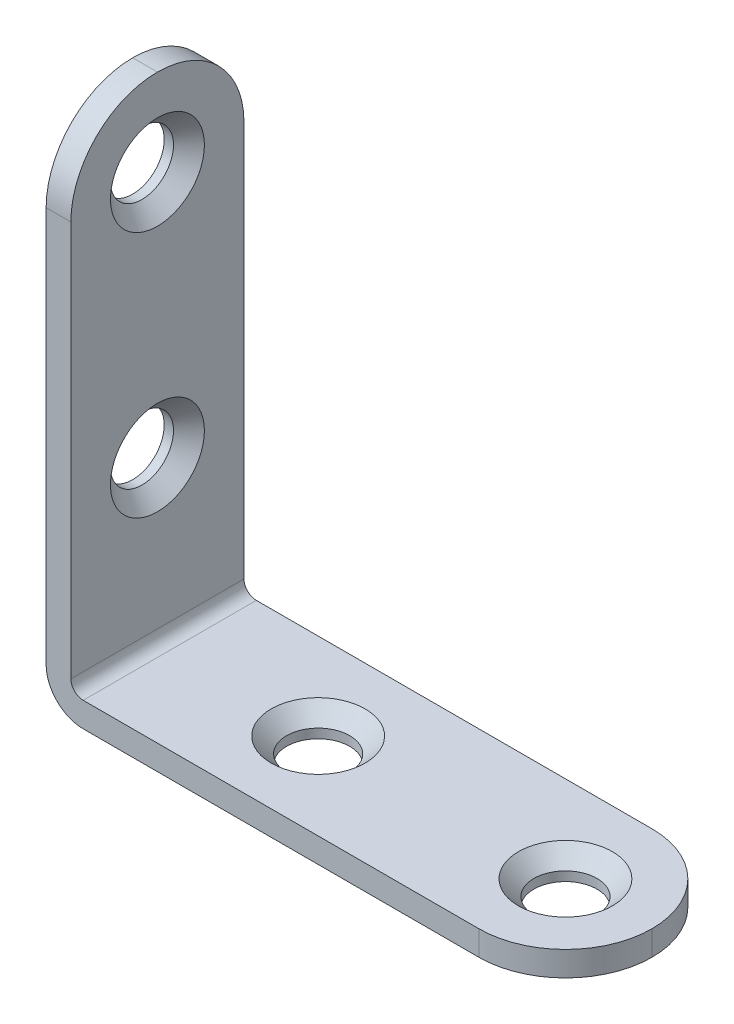
ISO-10303-21;
HEADER;
FILE_DESCRIPTION(('STEP AP214'),'2;1');
FILE_NAME('part.step','',(''),(''),'','','');
FILE_SCHEMA(('AUTOMOTIVE_DESIGN { 1 0 10303 214 1 1 1 1 }'));
ENDSEC;
DATA;
#1=APPLICATION_CONTEXT('core data for automotive mechanical design processes');
#2=APPLICATION_PROTOCOL_DEFINITION('international standard','automotive_design',2000,#1);
#3=PRODUCT_CONTEXT('',#1,'mechanical');
#4=PRODUCT('Part','Part','',(#3));
#5=PRODUCT_RELATED_PRODUCT_CATEGORY('part','',(#4));
#6=PRODUCT_DEFINITION_FORMATION('','',#4);
#7=PRODUCT_DEFINITION_CONTEXT('part definition',#1,'design');
#8=PRODUCT_DEFINITION('design','',#6,#7);
#9=PRODUCT_DEFINITION_SHAPE('','',#8);
#10=(LENGTH_UNIT() NAMED_UNIT(*) SI_UNIT(.MILLI.,.METRE.));
#11=(NAMED_UNIT(*) PLANE_ANGLE_UNIT() SI_UNIT($,.RADIAN.));
#12=(NAMED_UNIT(*) SI_UNIT($,.STERADIAN.) SOLID_ANGLE_UNIT());
#13=UNCERTAINTY_MEASURE_WITH_UNIT(LENGTH_MEASURE(1.E-05),#10,'distance_accuracy_value','');
#14=(GEOMETRIC_REPRESENTATION_CONTEXT(3) GLOBAL_UNCERTAINTY_ASSIGNED_CONTEXT((#13)) GLOBAL_UNIT_ASSIGNED_CONTEXT((#10,
#11,#12)) REPRESENTATION_CONTEXT('',''));
#15=CARTESIAN_POINT('',(0.,0.,0.));
#16=DIRECTION('',(0.,0.,1.));
#17=DIRECTION('',(1.,0.,0.));
#18=AXIS2_PLACEMENT_3D('',#15,#16,#17);
#19=CARTESIAN_POINT('',(0.,3.00000000000002,7.));
#20=DIRECTION('',(1.,0.,0.));
#21=DIRECTION('',(0.,0.,-1.));
#22=AXIS2_PLACEMENT_3D('',#19,#20,#21);
#23=PLANE('',#22);
#24=CARTESIAN_POINT('',(0.,35.,0.));
#25=DIRECTION('',(1.,0.,0.));
#26=DIRECTION('',(0.,0.,-1.));
#27=AXIS2_PLACEMENT_3D('',#24,#25,#26);
#28=CIRCLE('',#27,2.54999999999999);
#29=CARTESIAN_POINT('',(0.,35.,-2.54999999999999));
#30=VERTEX_POINT('',#29);
#31=EDGE_CURVE('E226',#30,#30,#28,.T.);
#32=ORIENTED_EDGE('',*,*,#31,.T.);
#33=EDGE_LOOP('',(#32));
#34=FACE_BOUND('',#33,.T.);
#35=CARTESIAN_POINT('',(0.,15.,0.));
#36=DIRECTION('',(1.,0.,0.));
#37=DIRECTION('',(0.,0.,-1.));
#38=AXIS2_PLACEMENT_3D('',#35,#36,#37);
#39=CIRCLE('',#38,2.54999999999999);
#40=CARTESIAN_POINT('',(0.,15.,-2.54999999999999));
#41=VERTEX_POINT('',#40);
#42=EDGE_CURVE('E217',#41,#41,#39,.T.);
#43=ORIENTED_EDGE('',*,*,#42,.T.);
#44=EDGE_LOOP('',(#43));
#45=FACE_BOUND('',#44,.T.);
#46=CARTESIAN_POINT('',(0.,35.,0.));
#47=DIRECTION('',(1.,0.,0.));
#48=DIRECTION('',(0.,0.,-1.));
#49=AXIS2_PLACEMENT_3D('',#46,#47,#48);
#50=CIRCLE('',#49,7.);
#51=CARTESIAN_POINT('',(0.,35.,7.));
#52=VERTEX_POINT('',#51);
#53=CARTESIAN_POINT('',(0.,42.,0.));
#54=VERTEX_POINT('',#53);
#55=EDGE_CURVE('E64',#52,#54,#50,.F.);
#56=ORIENTED_EDGE('',*,*,#55,.T.);
#57=CARTESIAN_POINT('',(0.,35.,0.));
#58=DIRECTION('',(1.,0.,0.));
#59=DIRECTION('',(0.,0.,-1.));
#60=AXIS2_PLACEMENT_3D('',#57,#58,#59);
#61=CIRCLE('',#60,7.);
#62=CARTESIAN_POINT('',(0.,35.,-7.));
#63=VERTEX_POINT('',#62);
#64=EDGE_CURVE('E188',#54,#63,#61,.F.);
#65=ORIENTED_EDGE('',*,*,#64,.T.);
#66=DIRECTION('',(0.,-1.,0.));
#67=VECTOR('',#66,1.);
#68=CARTESIAN_POINT('',(0.,3.00000000000002,-7.));
#69=LINE('',#68,#67);
#70=CARTESIAN_POINT('',(0.,3.00000000000002,-7.));
#71=VERTEX_POINT('',#70);
#72=EDGE_CURVE('E132',#63,#71,#69,.T.);
#73=ORIENTED_EDGE('',*,*,#72,.T.);
#74=DIRECTION('',(0.,0.,-1.));
#75=VECTOR('',#74,1.);
#76=CARTESIAN_POINT('',(0.,3.00000000000002,7.));
#77=LINE('',#76,#75);
#78=CARTESIAN_POINT('',(0.,3.00000000000002,7.));
#79=VERTEX_POINT('',#78);
#80=EDGE_CURVE('E130',#79,#71,#77,.T.);
#81=ORIENTED_EDGE('',*,*,#80,.F.);
#82=DIRECTION('',(0.,-1.,0.));
#83=VECTOR('',#82,1.);
#84=CARTESIAN_POINT('',(0.,3.00000000000002,7.));
#85=LINE('',#84,#83);
#86=EDGE_CURVE('E117',#52,#79,#85,.T.);
#87=ORIENTED_EDGE('',*,*,#86,.F.);
#88=EDGE_LOOP('',(#56,#65,#73,#81,#87));
#89=FACE_BOUND('',#88,.T.);
#90=ADVANCED_FACE('F41',(#34,#45,#89),#23,.F.);
#91=CARTESIAN_POINT('',(3.,3.,7.));
#92=DIRECTION('',(0.,0.,-1.));
#93=DIRECTION('',(-1.,0.,0.));
#94=AXIS2_PLACEMENT_3D('',#91,#92,#93);
#95=CYLINDRICAL_SURFACE('',#94,3.);
#96=CARTESIAN_POINT('',(3.,3.,-7.));
#97=DIRECTION('',(0.,0.,1.));
#98=DIRECTION('',(1.,0.,0.));
#99=AXIS2_PLACEMENT_3D('',#96,#97,#98);
#100=CIRCLE('',#99,3.);
#101=CARTESIAN_POINT('',(3.00000000000002,0.,-7.));
#102=VERTEX_POINT('',#101);
#103=EDGE_CURVE('E154',#71,#102,#100,.T.);
#104=ORIENTED_EDGE('',*,*,#103,.T.);
#105=DIRECTION('',(0.,0.,-1.));
#106=VECTOR('',#105,1.);
#107=CARTESIAN_POINT('',(3.00000000000002,0.,7.));
#108=LINE('',#107,#106);
#109=CARTESIAN_POINT('',(3.00000000000002,0.,7.));
#110=VERTEX_POINT('',#109);
#111=EDGE_CURVE('E136',#110,#102,#108,.T.);
#112=ORIENTED_EDGE('',*,*,#111,.F.);
#113=CARTESIAN_POINT('',(3.,3.,7.));
#114=DIRECTION('',(0.,0.,1.));
#115=DIRECTION('',(1.,0.,0.));
#116=AXIS2_PLACEMENT_3D('',#113,#114,#115);
#117=CIRCLE('',#116,3.);
#118=EDGE_CURVE('E122',#79,#110,#117,.T.);
#119=ORIENTED_EDGE('',*,*,#118,.F.);
#120=ORIENTED_EDGE('',*,*,#80,.T.);
#121=EDGE_LOOP('',(#104,#112,#119,#120));
#122=FACE_BOUND('',#121,.T.);
#123=ADVANCED_FACE('F138',(#122),#95,.T.);
#124=CARTESIAN_POINT('',(3.00000000000002,0.,7.));
#125=DIRECTION('',(0.,1.,0.));
#126=DIRECTION('',(0.,0.,1.));
#127=AXIS2_PLACEMENT_3D('',#124,#125,#126);
#128=PLANE('',#127);
#129=CARTESIAN_POINT('',(35.,0.,0.));
#130=DIRECTION('',(0.,1.,0.));
#131=DIRECTION('',(0.,0.,1.));
#132=AXIS2_PLACEMENT_3D('',#129,#130,#131);
#133=CIRCLE('',#132,2.55);
#134=CARTESIAN_POINT('',(35.,0.,2.55));
#135=VERTEX_POINT('',#134);
#136=EDGE_CURVE('E208',#135,#135,#133,.T.);
#137=ORIENTED_EDGE('',*,*,#136,.T.);
#138=EDGE_LOOP('',(#137));
#139=FACE_BOUND('',#138,.T.);
#140=CARTESIAN_POINT('',(15.,0.,0.));
#141=DIRECTION('',(0.,1.,0.));
#142=DIRECTION('',(0.,0.,1.));
#143=AXIS2_PLACEMENT_3D('',#140,#141,#142);
#144=CIRCLE('',#143,2.55);
#145=CARTESIAN_POINT('',(15.,0.,2.55));
#146=VERTEX_POINT('',#145);
#147=EDGE_CURVE('E195',#146,#146,#144,.T.);
#148=ORIENTED_EDGE('',*,*,#147,.T.);
#149=EDGE_LOOP('',(#148));
#150=FACE_BOUND('',#149,.T.);
#151=DIRECTION('',(1.,0.,0.));
#152=VECTOR('',#151,1.);
#153=CARTESIAN_POINT('',(3.00000000000002,0.,-7.));
#154=LINE('',#153,#152);
#155=CARTESIAN_POINT('',(35.,0.,-7.));
#156=VERTEX_POINT('',#155);
#157=EDGE_CURVE('E157',#102,#156,#154,.T.);
#158=ORIENTED_EDGE('',*,*,#157,.T.);
#159=CARTESIAN_POINT('',(35.,0.,0.));
#160=DIRECTION('',(0.,1.,0.));
#161=DIRECTION('',(0.,0.,1.));
#162=AXIS2_PLACEMENT_3D('',#159,#160,#161);
#163=CIRCLE('',#162,7.);
#164=CARTESIAN_POINT('',(42.,0.,0.));
#165=VERTEX_POINT('',#164);
#166=EDGE_CURVE('E182',#156,#165,#163,.F.);
#167=ORIENTED_EDGE('',*,*,#166,.T.);
#168=CARTESIAN_POINT('',(35.,0.,0.));
#169=DIRECTION('',(0.,1.,0.));
#170=DIRECTION('',(0.,0.,1.));
#171=AXIS2_PLACEMENT_3D('',#168,#169,#170);
#172=CIRCLE('',#171,7.);
#173=CARTESIAN_POINT('',(35.,0.,7.));
#174=VERTEX_POINT('',#173);
#175=EDGE_CURVE('E180',#165,#174,#172,.F.);
#176=ORIENTED_EDGE('',*,*,#175,.T.);
#177=DIRECTION('',(1.,0.,0.));
#178=VECTOR('',#177,1.);
#179=CARTESIAN_POINT('',(3.00000000000002,0.,7.));
#180=LINE('',#179,#178);
#181=EDGE_CURVE('E141',#110,#174,#180,.T.);
#182=ORIENTED_EDGE('',*,*,#181,.F.);
#183=ORIENTED_EDGE('',*,*,#111,.T.);
#184=EDGE_LOOP('',(#158,#167,#176,#182,#183));
#185=FACE_BOUND('',#184,.T.);
#186=ADVANCED_FACE('F273',(#139,#150,#185),#128,.F.);
#187=CARTESIAN_POINT('',(3.00000000000002,2.,7.));
#188=DIRECTION('',(0.,-1.,0.));
#189=DIRECTION('',(0.,0.,-1.));
#190=AXIS2_PLACEMENT_3D('',#187,#188,#189);
#191=PLANE('',#190);
#192=CARTESIAN_POINT('',(35.,2.,0.));
#193=DIRECTION('',(0.,1.,0.));
#194=DIRECTION('',(0.,0.,1.));
#195=AXIS2_PLACEMENT_3D('',#192,#193,#194);
#196=CIRCLE('',#195,3.8);
#197=CARTESIAN_POINT('',(35.,2.,3.8));
#198=VERTEX_POINT('',#197);
#199=EDGE_CURVE('E214',#198,#198,#196,.T.);
#200=ORIENTED_EDGE('',*,*,#199,.F.);
#201=EDGE_LOOP('',(#200));
#202=FACE_BOUND('',#201,.T.);
#203=CARTESIAN_POINT('',(15.,2.,0.));
#204=DIRECTION('',(0.,1.,0.));
#205=DIRECTION('',(0.,0.,1.));
#206=AXIS2_PLACEMENT_3D('',#203,#204,#205);
#207=CIRCLE('',#206,3.8);
#208=CARTESIAN_POINT('',(15.,2.,3.8));
#209=VERTEX_POINT('',#208);
#210=EDGE_CURVE('E203',#209,#209,#207,.T.);
#211=ORIENTED_EDGE('',*,*,#210,.F.);
#212=EDGE_LOOP('',(#211));
#213=FACE_BOUND('',#212,.T.);
#214=CARTESIAN_POINT('',(35.,2.,0.));
#215=DIRECTION('',(0.,-1.,0.));
#216=DIRECTION('',(0.,0.,-1.));
#217=AXIS2_PLACEMENT_3D('',#214,#215,#216);
#218=CIRCLE('',#217,7.);
#219=CARTESIAN_POINT('',(35.,2.,7.));
#220=VERTEX_POINT('',#219);
#221=CARTESIAN_POINT('',(42.,2.,0.));
#222=VERTEX_POINT('',#221);
#223=EDGE_CURVE('E135',#220,#222,#218,.F.);
#224=ORIENTED_EDGE('',*,*,#223,.T.);
#225=CARTESIAN_POINT('',(35.,2.,0.));
#226=DIRECTION('',(0.,-1.,0.));
#227=DIRECTION('',(0.,0.,-1.));
#228=AXIS2_PLACEMENT_3D('',#225,#226,#227);
#229=CIRCLE('',#228,7.);
#230=CARTESIAN_POINT('',(35.,2.,-7.));
#231=VERTEX_POINT('',#230);
#232=EDGE_CURVE('E172',#222,#231,#229,.F.);
#233=ORIENTED_EDGE('',*,*,#232,.T.);
#234=DIRECTION('',(-1.,0.,0.));
#235=VECTOR('',#234,1.);
#236=CARTESIAN_POINT('',(3.00000000000002,2.,-7.));
#237=LINE('',#236,#235);
#238=CARTESIAN_POINT('',(3.00000000000002,2.,-7.));
#239=VERTEX_POINT('',#238);
#240=EDGE_CURVE('E160',#231,#239,#237,.T.);
#241=ORIENTED_EDGE('',*,*,#240,.T.);
#242=DIRECTION('',(0.,0.,-1.));
#243=VECTOR('',#242,1.);
#244=CARTESIAN_POINT('',(3.00000000000002,2.,7.));
#245=LINE('',#244,#243);
#246=CARTESIAN_POINT('',(3.00000000000002,2.,7.));
#247=VERTEX_POINT('',#246);
#248=EDGE_CURVE('E167',#247,#239,#245,.T.);
#249=ORIENTED_EDGE('',*,*,#248,.F.);
#250=DIRECTION('',(-1.,0.,0.));
#251=VECTOR('',#250,1.);
#252=CARTESIAN_POINT('',(3.00000000000002,2.,7.));
#253=LINE('',#252,#251);
#254=EDGE_CURVE('E143',#220,#247,#253,.T.);
#255=ORIENTED_EDGE('',*,*,#254,.F.);
#256=EDGE_LOOP('',(#224,#233,#241,#249,#255));
#257=FACE_BOUND('',#256,.T.);
#258=ADVANCED_FACE('F292',(#202,#213,#257),#191,.F.);
#259=CARTESIAN_POINT('',(3.,3.,7.));
#260=DIRECTION('',(0.,0.,-1.));
#261=DIRECTION('',(-1.,0.,0.));
#262=AXIS2_PLACEMENT_3D('',#259,#260,#261);
#263=CYLINDRICAL_SURFACE('',#262,1.);
#264=CARTESIAN_POINT('',(3.,3.,-7.));
#265=DIRECTION('',(0.,0.,-1.));
#266=DIRECTION('',(1.,0.,0.));
#267=AXIS2_PLACEMENT_3D('',#264,#265,#266);
#268=CIRCLE('',#267,1.);
#269=CARTESIAN_POINT('',(2.,3.00000000000001,-7.));
#270=VERTEX_POINT('',#269);
#271=EDGE_CURVE('E162',#239,#270,#268,.T.);
#272=ORIENTED_EDGE('',*,*,#271,.T.);
#273=DIRECTION('',(0.,0.,-1.));
#274=VECTOR('',#273,1.);
#275=CARTESIAN_POINT('',(2.,3.00000000000001,7.));
#276=LINE('',#275,#274);
#277=CARTESIAN_POINT('',(2.,3.00000000000001,7.));
#278=VERTEX_POINT('',#277);
#279=EDGE_CURVE('E152',#278,#270,#276,.T.);
#280=ORIENTED_EDGE('',*,*,#279,.F.);
#281=CARTESIAN_POINT('',(3.,3.,7.));
#282=DIRECTION('',(0.,0.,-1.));
#283=DIRECTION('',(1.,0.,0.));
#284=AXIS2_PLACEMENT_3D('',#281,#282,#283);
#285=CIRCLE('',#284,1.);
#286=EDGE_CURVE('E148',#247,#278,#285,.T.);
#287=ORIENTED_EDGE('',*,*,#286,.F.);
#288=ORIENTED_EDGE('',*,*,#248,.T.);
#289=EDGE_LOOP('',(#272,#280,#287,#288));
#290=FACE_BOUND('',#289,.T.);
#291=ADVANCED_FACE('F241',(#290),#263,.F.);
#292=CARTESIAN_POINT('',(2.,3.00000000000001,7.));
#293=DIRECTION('',(-1.,0.,0.));
#294=DIRECTION('',(0.,0.,1.));
#295=AXIS2_PLACEMENT_3D('',#292,#293,#294);
#296=PLANE('',#295);
#297=CARTESIAN_POINT('',(2.,35.,0.));
#298=DIRECTION('',(1.,0.,0.));
#299=DIRECTION('',(0.,0.,-1.));
#300=AXIS2_PLACEMENT_3D('',#297,#298,#299);
#301=CIRCLE('',#300,3.8);
#302=CARTESIAN_POINT('',(2.,35.,-3.8));
#303=VERTEX_POINT('',#302);
#304=EDGE_CURVE('E232',#303,#303,#301,.T.);
#305=ORIENTED_EDGE('',*,*,#304,.F.);
#306=EDGE_LOOP('',(#305));
#307=FACE_BOUND('',#306,.T.);
#308=CARTESIAN_POINT('',(2.,15.,0.));
#309=DIRECTION('',(1.,0.,0.));
#310=DIRECTION('',(0.,0.,-1.));
#311=AXIS2_PLACEMENT_3D('',#308,#309,#310);
#312=CIRCLE('',#311,3.8);
#313=CARTESIAN_POINT('',(2.,15.,-3.8));
#314=VERTEX_POINT('',#313);
#315=EDGE_CURVE('E223',#314,#314,#312,.T.);
#316=ORIENTED_EDGE('',*,*,#315,.F.);
#317=EDGE_LOOP('',(#316));
#318=FACE_BOUND('',#317,.T.);
#319=DIRECTION('',(0.,1.,0.));
#320=VECTOR('',#319,1.);
#321=CARTESIAN_POINT('',(2.,3.00000000000001,-7.));
#322=LINE('',#321,#320);
#323=CARTESIAN_POINT('',(2.,35.,-7.));
#324=VERTEX_POINT('',#323);
#325=EDGE_CURVE('E127',#270,#324,#322,.T.);
#326=ORIENTED_EDGE('',*,*,#325,.T.);
#327=CARTESIAN_POINT('',(2.,35.,0.));
#328=DIRECTION('',(-1.,0.,0.));
#329=DIRECTION('',(0.,0.,1.));
#330=AXIS2_PLACEMENT_3D('',#327,#328,#329);
#331=CIRCLE('',#330,7.);
#332=CARTESIAN_POINT('',(2.,42.,0.));
#333=VERTEX_POINT('',#332);
#334=EDGE_CURVE('E11',#324,#333,#331,.F.);
#335=ORIENTED_EDGE('',*,*,#334,.T.);
#336=CARTESIAN_POINT('',(2.,35.,0.));
#337=DIRECTION('',(-1.,0.,0.));
#338=DIRECTION('',(0.,0.,1.));
#339=AXIS2_PLACEMENT_3D('',#336,#337,#338);
#340=CIRCLE('',#339,7.);
#341=CARTESIAN_POINT('',(2.,35.,7.));
#342=VERTEX_POINT('',#341);
#343=EDGE_CURVE('E50',#333,#342,#340,.F.);
#344=ORIENTED_EDGE('',*,*,#343,.T.);
#345=DIRECTION('',(0.,1.,0.));
#346=VECTOR('',#345,1.);
#347=CARTESIAN_POINT('',(2.,3.00000000000001,7.));
#348=LINE('',#347,#346);
#349=EDGE_CURVE('E150',#278,#342,#348,.T.);
#350=ORIENTED_EDGE('',*,*,#349,.F.);
#351=ORIENTED_EDGE('',*,*,#279,.T.);
#352=EDGE_LOOP('',(#326,#335,#344,#350,#351));
#353=FACE_BOUND('',#352,.T.);
#354=ADVANCED_FACE('F238',(#307,#318,#353),#296,.F.);
#355=CARTESIAN_POINT('',(3.,3.,7.));
#356=DIRECTION('',(0.,0.,1.));
#357=DIRECTION('',(1.,0.,0.));
#358=AXIS2_PLACEMENT_3D('',#355,#356,#357);
#359=PLANE('',#358);
#360=ORIENTED_EDGE('',*,*,#181,.T.);
#361=DIRECTION('',(0.,1.,0.));
#362=VECTOR('',#361,1.);
#363=CARTESIAN_POINT('',(35.,2.,7.));
#364=LINE('',#363,#362);
#365=EDGE_CURVE('E185',#174,#220,#364,.T.);
#366=ORIENTED_EDGE('',*,*,#365,.T.);
#367=ORIENTED_EDGE('',*,*,#254,.T.);
#368=ORIENTED_EDGE('',*,*,#286,.T.);
#369=ORIENTED_EDGE('',*,*,#349,.T.);
#370=DIRECTION('',(-1.,0.,0.));
#371=VECTOR('',#370,1.);
#372=CARTESIAN_POINT('',(0.,35.,7.));
#373=LINE('',#372,#371);
#374=EDGE_CURVE('E126',#342,#52,#373,.T.);
#375=ORIENTED_EDGE('',*,*,#374,.T.);
#376=ORIENTED_EDGE('',*,*,#86,.T.);
#377=ORIENTED_EDGE('',*,*,#118,.T.);
#378=EDGE_LOOP('',(#360,#366,#367,#368,#369,#375,#376,#377));
#379=FACE_BOUND('',#378,.T.);
#380=ADVANCED_FACE('F120',(#379),#359,.T.);
#381=CARTESIAN_POINT('',(3.,3.,-7.));
#382=DIRECTION('',(0.,0.,1.));
#383=DIRECTION('',(1.,0.,0.));
#384=AXIS2_PLACEMENT_3D('',#381,#382,#383);
#385=PLANE('',#384);
#386=ORIENTED_EDGE('',*,*,#240,.F.);
#387=DIRECTION('',(0.,1.,0.));
#388=VECTOR('',#387,1.);
#389=CARTESIAN_POINT('',(35.,3.,-7.));
#390=LINE('',#389,#388);
#391=EDGE_CURVE('E177',#231,#156,#390,.F.);
#392=ORIENTED_EDGE('',*,*,#391,.T.);
#393=ORIENTED_EDGE('',*,*,#157,.F.);
#394=ORIENTED_EDGE('',*,*,#103,.F.);
#395=ORIENTED_EDGE('',*,*,#72,.F.);
#396=DIRECTION('',(-1.,0.,0.));
#397=VECTOR('',#396,1.);
#398=CARTESIAN_POINT('',(3.,35.,-7.));
#399=LINE('',#398,#397);
#400=EDGE_CURVE('E174',#63,#324,#399,.F.);
#401=ORIENTED_EDGE('',*,*,#400,.T.);
#402=ORIENTED_EDGE('',*,*,#325,.F.);
#403=ORIENTED_EDGE('',*,*,#271,.F.);
#404=EDGE_LOOP('',(#386,#392,#393,#394,#395,#401,#402,#403));
#405=FACE_BOUND('',#404,.T.);
#406=ADVANCED_FACE('F250',(#405),#385,.F.);
#407=CARTESIAN_POINT('',(35.,3.,0.));
#408=DIRECTION('',(0.,-1.,0.));
#409=DIRECTION('',(0.,0.,-1.));
#410=AXIS2_PLACEMENT_3D('',#407,#408,#409);
#411=CYLINDRICAL_SURFACE('',#410,7.);
#412=ORIENTED_EDGE('',*,*,#365,.F.);
#413=ORIENTED_EDGE('',*,*,#175,.F.);
#414=DIRECTION('',(0.,1.,0.));
#415=VECTOR('',#414,1.);
#416=CARTESIAN_POINT('',(42.,0.,0.));
#417=LINE('',#416,#415);
#418=EDGE_CURVE('E155',#222,#165,#417,.F.);
#419=ORIENTED_EDGE('',*,*,#418,.F.);
#420=ORIENTED_EDGE('',*,*,#223,.F.);
#421=EDGE_LOOP('',(#412,#413,#419,#420));
#422=FACE_BOUND('',#421,.T.);
#423=ADVANCED_FACE('F279',(#422),#411,.T.);
#424=CARTESIAN_POINT('',(35.,2.,0.));
#425=DIRECTION('',(0.,1.,0.));
#426=DIRECTION('',(0.,0.,1.));
#427=AXIS2_PLACEMENT_3D('',#424,#425,#426);
#428=CYLINDRICAL_SURFACE('',#427,7.);
#429=ORIENTED_EDGE('',*,*,#166,.F.);
#430=ORIENTED_EDGE('',*,*,#391,.F.);
#431=ORIENTED_EDGE('',*,*,#232,.F.);
#432=ORIENTED_EDGE('',*,*,#418,.T.);
#433=EDGE_LOOP('',(#429,#430,#431,#432));
#434=FACE_BOUND('',#433,.T.);
#435=ADVANCED_FACE('F263',(#434),#428,.T.);
#436=CARTESIAN_POINT('',(3.,35.,0.));
#437=DIRECTION('',(1.,0.,0.));
#438=DIRECTION('',(0.,0.,-1.));
#439=AXIS2_PLACEMENT_3D('',#436,#437,#438);
#440=CYLINDRICAL_SURFACE('',#439,7.);
#441=ORIENTED_EDGE('',*,*,#374,.F.);
#442=ORIENTED_EDGE('',*,*,#343,.F.);
#443=DIRECTION('',(-1.,0.,0.));
#444=VECTOR('',#443,1.);
#445=CARTESIAN_POINT('',(2.,42.,0.));
#446=LINE('',#445,#444);
#447=EDGE_CURVE('E45',#54,#333,#446,.F.);
#448=ORIENTED_EDGE('',*,*,#447,.F.);
#449=ORIENTED_EDGE('',*,*,#55,.F.);
#450=EDGE_LOOP('',(#441,#442,#448,#449));
#451=FACE_BOUND('',#450,.T.);
#452=ADVANCED_FACE('F43',(#451),#440,.T.);
#453=CARTESIAN_POINT('',(0.,35.,0.));
#454=DIRECTION('',(-1.,0.,0.));
#455=DIRECTION('',(0.,0.,1.));
#456=AXIS2_PLACEMENT_3D('',#453,#454,#455);
#457=CYLINDRICAL_SURFACE('',#456,7.);
#458=ORIENTED_EDGE('',*,*,#334,.F.);
#459=ORIENTED_EDGE('',*,*,#400,.F.);
#460=ORIENTED_EDGE('',*,*,#64,.F.);
#461=ORIENTED_EDGE('',*,*,#447,.T.);
#462=EDGE_LOOP('',(#458,#459,#460,#461));
#463=FACE_BOUND('',#462,.T.);
#464=ADVANCED_FACE('F252',(#463),#457,.T.);
#465=CARTESIAN_POINT('',(15.,2.,0.));
#466=DIRECTION('',(0.,1.,0.));
#467=DIRECTION('',(0.,0.,1.));
#468=AXIS2_PLACEMENT_3D('',#465,#466,#467);
#469=CYLINDRICAL_SURFACE('',#468,2.55);
#470=ORIENTED_EDGE('',*,*,#147,.F.);
#471=EDGE_LOOP('',(#470));
#472=FACE_BOUND('',#471,.T.);
#473=CARTESIAN_POINT('',(15.,0.75,0.));
#474=DIRECTION('',(0.,1.,0.));
#475=DIRECTION('',(0.,0.,1.));
#476=AXIS2_PLACEMENT_3D('',#473,#474,#475);
#477=CIRCLE('',#476,2.55);
#478=CARTESIAN_POINT('',(15.,0.75,2.55));
#479=VERTEX_POINT('',#478);
#480=EDGE_CURVE('E199',#479,#479,#477,.T.);
#481=ORIENTED_EDGE('',*,*,#480,.T.);
#482=EDGE_LOOP('',(#481));
#483=FACE_BOUND('',#482,.T.);
#484=ADVANCED_FACE('F254',(#472,#483),#469,.F.);
#485=CARTESIAN_POINT('',(15.,2.,0.));
#486=DIRECTION('',(0.,1.,0.));
#487=DIRECTION('',(0.,0.,1.));
#488=AXIS2_PLACEMENT_3D('',#485,#486,#487);
#489=CONICAL_SURFACE('',#488,3.8,0.785398163397449);
#490=ORIENTED_EDGE('',*,*,#480,.F.);
#491=EDGE_LOOP('',(#490));
#492=FACE_BOUND('',#491,.T.);
#493=ORIENTED_EDGE('',*,*,#210,.T.);
#494=EDGE_LOOP('',(#493));
#495=FACE_BOUND('',#494,.T.);
#496=ADVANCED_FACE('F260',(#492,#495),#489,.F.);
#497=CARTESIAN_POINT('',(35.,2.,0.));
#498=DIRECTION('',(0.,1.,0.));
#499=DIRECTION('',(0.,0.,1.));
#500=AXIS2_PLACEMENT_3D('',#497,#498,#499);
#501=CYLINDRICAL_SURFACE('',#500,2.55);
#502=ORIENTED_EDGE('',*,*,#136,.F.);
#503=EDGE_LOOP('',(#502));
#504=FACE_BOUND('',#503,.T.);
#505=CARTESIAN_POINT('',(35.,0.75,0.));
#506=DIRECTION('',(0.,1.,0.));
#507=DIRECTION('',(0.,0.,1.));
#508=AXIS2_PLACEMENT_3D('',#505,#506,#507);
#509=CIRCLE('',#508,2.55);
#510=CARTESIAN_POINT('',(35.,0.75,2.55));
#511=VERTEX_POINT('',#510);
#512=EDGE_CURVE('E211',#511,#511,#509,.T.);
#513=ORIENTED_EDGE('',*,*,#512,.T.);
#514=EDGE_LOOP('',(#513));
#515=FACE_BOUND('',#514,.T.);
#516=ADVANCED_FACE('F311',(#504,#515),#501,.F.);
#517=CARTESIAN_POINT('',(35.,2.,0.));
#518=DIRECTION('',(0.,1.,0.));
#519=DIRECTION('',(0.,0.,1.));
#520=AXIS2_PLACEMENT_3D('',#517,#518,#519);
#521=CONICAL_SURFACE('',#520,3.8,0.785398163397449);
#522=ORIENTED_EDGE('',*,*,#512,.F.);
#523=EDGE_LOOP('',(#522));
#524=FACE_BOUND('',#523,.T.);
#525=ORIENTED_EDGE('',*,*,#199,.T.);
#526=EDGE_LOOP('',(#525));
#527=FACE_BOUND('',#526,.T.);
#528=ADVANCED_FACE('F314',(#524,#527),#521,.F.);
#529=CARTESIAN_POINT('',(2.,15.,0.));
#530=DIRECTION('',(1.,0.,0.));
#531=DIRECTION('',(0.,0.,-1.));
#532=AXIS2_PLACEMENT_3D('',#529,#530,#531);
#533=CYLINDRICAL_SURFACE('',#532,2.54999999999999);
#534=ORIENTED_EDGE('',*,*,#42,.F.);
#535=EDGE_LOOP('',(#534));
#536=FACE_BOUND('',#535,.T.);
#537=CARTESIAN_POINT('',(0.75,15.,0.));
#538=DIRECTION('',(1.,0.,0.));
#539=DIRECTION('',(0.,0.,-1.));
#540=AXIS2_PLACEMENT_3D('',#537,#538,#539);
#541=CIRCLE('',#540,2.55);
#542=CARTESIAN_POINT('',(0.75,15.,-2.55));
#543=VERTEX_POINT('',#542);
#544=EDGE_CURVE('E220',#543,#543,#541,.T.);
#545=ORIENTED_EDGE('',*,*,#544,.T.);
#546=EDGE_LOOP('',(#545));
#547=FACE_BOUND('',#546,.T.);
#548=ADVANCED_FACE('F319',(#536,#547),#533,.F.);
#549=CARTESIAN_POINT('',(2.,15.,0.));
#550=DIRECTION('',(1.,0.,0.));
#551=DIRECTION('',(0.,0.,-1.));
#552=AXIS2_PLACEMENT_3D('',#549,#550,#551);
#553=CONICAL_SURFACE('',#552,3.8,0.785398163397449);
#554=ORIENTED_EDGE('',*,*,#544,.F.);
#555=EDGE_LOOP('',(#554));
#556=FACE_BOUND('',#555,.T.);
#557=ORIENTED_EDGE('',*,*,#315,.T.);
#558=EDGE_LOOP('',(#557));
#559=FACE_BOUND('',#558,.T.);
#560=ADVANCED_FACE('F372',(#556,#559),#553,.F.);
#561=CARTESIAN_POINT('',(2.,35.,0.));
#562=DIRECTION('',(1.,0.,0.));
#563=DIRECTION('',(0.,0.,-1.));
#564=AXIS2_PLACEMENT_3D('',#561,#562,#563);
#565=CYLINDRICAL_SURFACE('',#564,2.54999999999999);
#566=ORIENTED_EDGE('',*,*,#31,.F.);
#567=EDGE_LOOP('',(#566));
#568=FACE_BOUND('',#567,.T.);
#569=CARTESIAN_POINT('',(0.75,35.,0.));
#570=DIRECTION('',(1.,0.,0.));
#571=DIRECTION('',(0.,0.,-1.));
#572=AXIS2_PLACEMENT_3D('',#569,#570,#571);
#573=CIRCLE('',#572,2.55);
#574=CARTESIAN_POINT('',(0.75,35.,-2.55));
#575=VERTEX_POINT('',#574);
#576=EDGE_CURVE('E229',#575,#575,#573,.T.);
#577=ORIENTED_EDGE('',*,*,#576,.T.);
#578=EDGE_LOOP('',(#577));
#579=FACE_BOUND('',#578,.T.);
#580=ADVANCED_FACE('F380',(#568,#579),#565,.F.);
#581=CARTESIAN_POINT('',(2.,35.,0.));
#582=DIRECTION('',(1.,0.,0.));
#583=DIRECTION('',(0.,0.,-1.));
#584=AXIS2_PLACEMENT_3D('',#581,#582,#583);
#585=CONICAL_SURFACE('',#584,3.8,0.785398163397449);
#586=ORIENTED_EDGE('',*,*,#576,.F.);
#587=EDGE_LOOP('',(#586));
#588=FACE_BOUND('',#587,.T.);
#589=ORIENTED_EDGE('',*,*,#304,.T.);
#590=EDGE_LOOP('',(#589));
#591=FACE_BOUND('',#590,.T.);
#592=ADVANCED_FACE('F236',(#588,#591),#585,.F.);
#593=CLOSED_SHELL('',(#90,#123,#186,#258,#291,#354,#380,#406,#423,#435,#452,#464,#484,#496,#516,
#528,#548,#560,#580,#592));
#594=MANIFOLD_SOLID_BREP('B2',#593);
#595=ADVANCED_BREP_SHAPE_REPRESENTATION('',(#18,#594),#14);
#596=SHAPE_DEFINITION_REPRESENTATION(#9,#595);
ENDSEC;
END-ISO-10303-21;
